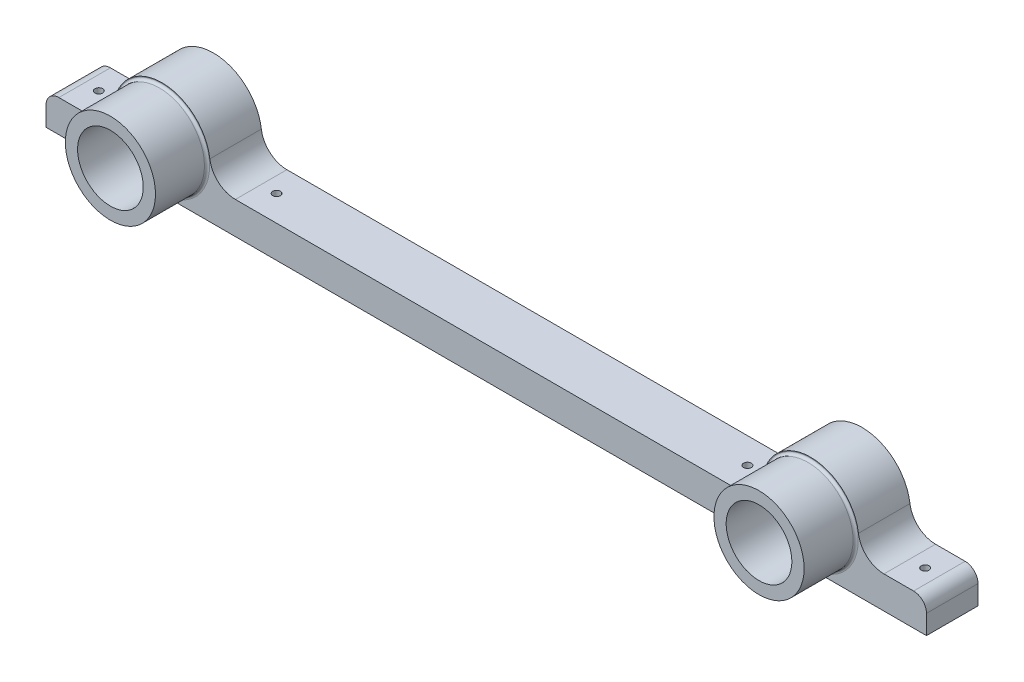
ISO-10303-21;
HEADER;
FILE_DESCRIPTION(('STEP AP214'),'2;1');
FILE_NAME('part.step','',(''),(''),'','','');
FILE_SCHEMA(('AUTOMOTIVE_DESIGN { 1 0 10303 214 1 1 1 1 }'));
ENDSEC;
DATA;
#1=APPLICATION_CONTEXT('core data for automotive mechanical design processes');
#2=APPLICATION_PROTOCOL_DEFINITION('international standard','automotive_design',2000,#1);
#3=PRODUCT_CONTEXT('',#1,'mechanical');
#4=PRODUCT('Part','Part','',(#3));
#5=PRODUCT_RELATED_PRODUCT_CATEGORY('part','',(#4));
#6=PRODUCT_DEFINITION_FORMATION('','',#4);
#7=PRODUCT_DEFINITION_CONTEXT('part definition',#1,'design');
#8=PRODUCT_DEFINITION('design','',#6,#7);
#9=PRODUCT_DEFINITION_SHAPE('','',#8);
#10=(LENGTH_UNIT() NAMED_UNIT(*) SI_UNIT(.MILLI.,.METRE.));
#11=(NAMED_UNIT(*) PLANE_ANGLE_UNIT() SI_UNIT($,.RADIAN.));
#12=(NAMED_UNIT(*) SI_UNIT($,.STERADIAN.) SOLID_ANGLE_UNIT());
#13=UNCERTAINTY_MEASURE_WITH_UNIT(LENGTH_MEASURE(1.E-05),#10,'distance_accuracy_value','');
#14=(GEOMETRIC_REPRESENTATION_CONTEXT(3) GLOBAL_UNCERTAINTY_ASSIGNED_CONTEXT((#13)) GLOBAL_UNIT_ASSIGNED_CONTEXT((#10,
#11,#12)) REPRESENTATION_CONTEXT('',''));
#15=CARTESIAN_POINT('',(0.,0.,0.));
#16=DIRECTION('',(0.,0.,1.));
#17=DIRECTION('',(1.,0.,0.));
#18=AXIS2_PLACEMENT_3D('',#15,#16,#17);
#19=CARTESIAN_POINT('',(70.29958,4.7625,5.08));
#20=DIRECTION('',(0.,0.,-1.));
#21=DIRECTION('',(-1.,0.,0.));
#22=AXIS2_PLACEMENT_3D('',#19,#20,#21);
#23=CYLINDRICAL_SURFACE('',#22,0.635000000000002);
#24=CARTESIAN_POINT('',(70.29958,4.7625,0.));
#25=DIRECTION('',(0.,0.,1.));
#26=DIRECTION('',(1.,0.,0.));
#27=AXIS2_PLACEMENT_3D('',#24,#25,#26);
#28=CIRCLE('',#27,0.635000000000002);
#29=CARTESIAN_POINT('',(70.93458,4.7625,0.));
#30=VERTEX_POINT('',#29);
#31=EDGE_CURVE('E505',#30,#30,#28,.T.);
#32=ORIENTED_EDGE('',*,*,#31,.F.);
#33=EDGE_LOOP('',(#32));
#34=FACE_BOUND('',#33,.T.);
#35=CARTESIAN_POINT('',(70.29958,4.7625,3.81));
#36=DIRECTION('',(0.,0.,1.));
#37=DIRECTION('',(1.,0.,0.));
#38=AXIS2_PLACEMENT_3D('',#35,#36,#37);
#39=CIRCLE('',#38,0.635000000000002);
#40=CARTESIAN_POINT('',(70.93458,4.7625,3.81));
#41=VERTEX_POINT('',#40);
#42=EDGE_CURVE('E200',#41,#41,#39,.T.);
#43=ORIENTED_EDGE('',*,*,#42,.T.);
#44=EDGE_LOOP('',(#43));
#45=FACE_BOUND('',#44,.T.);
#46=ADVANCED_FACE('F33',(#34,#45),#23,.F.);
#47=CARTESIAN_POINT('',(6.35,4.7625,5.08));
#48=DIRECTION('',(0.,0.,-1.));
#49=DIRECTION('',(-1.,0.,0.));
#50=AXIS2_PLACEMENT_3D('',#47,#48,#49);
#51=CYLINDRICAL_SURFACE('',#50,0.635000000000001);
#52=CARTESIAN_POINT('',(6.35,4.7625,0.));
#53=DIRECTION('',(0.,0.,1.));
#54=DIRECTION('',(1.,0.,0.));
#55=AXIS2_PLACEMENT_3D('',#52,#53,#54);
#56=CIRCLE('',#55,0.635000000000001);
#57=CARTESIAN_POINT('',(6.985,4.7625,0.));
#58=VERTEX_POINT('',#57);
#59=EDGE_CURVE('E178',#58,#58,#56,.T.);
#60=ORIENTED_EDGE('',*,*,#59,.F.);
#61=EDGE_LOOP('',(#60));
#62=FACE_BOUND('',#61,.T.);
#63=CARTESIAN_POINT('',(6.35,4.7625,3.81));
#64=DIRECTION('',(0.,0.,1.));
#65=DIRECTION('',(1.,0.,0.));
#66=AXIS2_PLACEMENT_3D('',#63,#64,#65);
#67=CIRCLE('',#66,0.635000000000001);
#68=CARTESIAN_POINT('',(6.985,4.7625,3.81));
#69=VERTEX_POINT('',#68);
#70=EDGE_CURVE('E195',#69,#69,#67,.T.);
#71=ORIENTED_EDGE('',*,*,#70,.T.);
#72=EDGE_LOOP('',(#71));
#73=FACE_BOUND('',#72,.T.);
#74=ADVANCED_FACE('F324',(#62,#73),#51,.F.);
#75=CARTESIAN_POINT('',(70.29958,4.7625,5.08));
#76=DIRECTION('',(0.,0.,1.));
#77=DIRECTION('',(1.,0.,0.));
#78=AXIS2_PLACEMENT_3D('',#75,#76,#77);
#79=PLANE('',#78);
#80=CARTESIAN_POINT('',(70.29958,4.7625,5.08));
#81=DIRECTION('',(0.,0.,1.));
#82=DIRECTION('',(1.,0.,0.));
#83=AXIS2_PLACEMENT_3D('',#80,#81,#82);
#84=CIRCLE('',#83,4.69899999999999);
#85=CARTESIAN_POINT('',(74.99858,4.7625,5.08));
#86=VERTEX_POINT('',#85);
#87=EDGE_CURVE('E210',#86,#86,#84,.F.);
#88=ORIENTED_EDGE('',*,*,#87,.T.);
#89=EDGE_LOOP('',(#88));
#90=FACE_BOUND('',#89,.T.);
#91=CARTESIAN_POINT('',(6.35,4.7625,5.08));
#92=DIRECTION('',(0.,0.,1.));
#93=DIRECTION('',(1.,0.,0.));
#94=AXIS2_PLACEMENT_3D('',#91,#92,#93);
#95=CIRCLE('',#94,4.699);
#96=CARTESIAN_POINT('',(11.049,4.7625,5.08));
#97=VERTEX_POINT('',#96);
#98=EDGE_CURVE('E207',#97,#97,#95,.F.);
#99=ORIENTED_EDGE('',*,*,#98,.T.);
#100=EDGE_LOOP('',(#99));
#101=FACE_BOUND('',#100,.T.);
#102=DIRECTION('',(0.,1.,0.));
#103=VECTOR('',#102,1.);
#104=CARTESIAN_POINT('',(81.72958,3.175,5.08));
#105=LINE('',#104,#103);
#106=CARTESIAN_POINT('',(81.72958,0.,5.08));
#107=VERTEX_POINT('',#106);
#108=CARTESIAN_POINT('',(81.72958,1.90500000000001,5.08));
#109=VERTEX_POINT('',#108);
#110=EDGE_CURVE('E137',#107,#109,#105,.T.);
#111=ORIENTED_EDGE('',*,*,#110,.T.);
#112=CARTESIAN_POINT('',(80.45958,1.90500000000001,5.08));
#113=DIRECTION('',(0.,0.,1.));
#114=DIRECTION('',(1.,0.,0.));
#115=AXIS2_PLACEMENT_3D('',#112,#113,#114);
#116=CIRCLE('',#115,1.27);
#117=CARTESIAN_POINT('',(80.45958,3.175,5.08));
#118=VERTEX_POINT('',#117);
#119=EDGE_CURVE('E263',#109,#118,#116,.T.);
#120=ORIENTED_EDGE('',*,*,#119,.T.);
#121=DIRECTION('',(-1.,0.,0.));
#122=VECTOR('',#121,1.);
#123=CARTESIAN_POINT('',(76.64958,3.175,5.08));
#124=LINE('',#123,#122);
#125=CARTESIAN_POINT('',(77.5396939493795,3.175,5.08));
#126=VERTEX_POINT('',#125);
#127=EDGE_CURVE('E159',#118,#126,#124,.T.);
#128=ORIENTED_EDGE('',*,*,#127,.T.);
#129=CARTESIAN_POINT('',(77.5396939493795,5.71500000000001,5.08));
#130=DIRECTION('',(0.,0.,1.));
#131=DIRECTION('',(1.,0.,0.));
#132=AXIS2_PLACEMENT_3D('',#129,#130,#131);
#133=CIRCLE('',#132,2.54);
#134=CARTESIAN_POINT('',(75.0213934452475,5.38369565217392,5.08));
#135=VERTEX_POINT('',#134);
#136=EDGE_CURVE('E240',#126,#135,#133,.F.);
#137=ORIENTED_EDGE('',*,*,#136,.T.);
#138=CARTESIAN_POINT('',(70.29958,4.7625,5.08));
#139=DIRECTION('',(0.,0.,1.));
#140=DIRECTION('',(1.,0.,0.));
#141=AXIS2_PLACEMENT_3D('',#138,#139,#140);
#142=CIRCLE('',#141,4.7625);
#143=CARTESIAN_POINT('',(65.5777665547525,5.38369565217391,5.08));
#144=VERTEX_POINT('',#143);
#145=EDGE_CURVE('E161',#135,#144,#142,.T.);
#146=ORIENTED_EDGE('',*,*,#145,.T.);
#147=CARTESIAN_POINT('',(63.0594660506205,5.715,5.08));
#148=DIRECTION('',(0.,0.,1.));
#149=DIRECTION('',(1.,0.,0.));
#150=AXIS2_PLACEMENT_3D('',#147,#148,#149);
#151=CIRCLE('',#150,2.54);
#152=CARTESIAN_POINT('',(63.0594660506205,3.175,5.08));
#153=VERTEX_POINT('',#152);
#154=EDGE_CURVE('E248',#144,#153,#151,.F.);
#155=ORIENTED_EDGE('',*,*,#154,.T.);
#156=DIRECTION('',(-1.,0.,0.));
#157=VECTOR('',#156,1.);
#158=CARTESIAN_POINT('',(11.1125,3.175,5.08));
#159=LINE('',#158,#157);
#160=CARTESIAN_POINT('',(13.5901139493795,3.175,5.08));
#161=VERTEX_POINT('',#160);
#162=EDGE_CURVE('E167',#153,#161,#159,.T.);
#163=ORIENTED_EDGE('',*,*,#162,.T.);
#164=CARTESIAN_POINT('',(13.5901139493795,5.715,5.08));
#165=DIRECTION('',(0.,0.,1.));
#166=DIRECTION('',(1.,0.,0.));
#167=AXIS2_PLACEMENT_3D('',#164,#165,#166);
#168=CIRCLE('',#167,2.54);
#169=CARTESIAN_POINT('',(11.0718134452475,5.38369565217391,5.08));
#170=VERTEX_POINT('',#169);
#171=EDGE_CURVE('E244',#161,#170,#168,.F.);
#172=ORIENTED_EDGE('',*,*,#171,.T.);
#173=CARTESIAN_POINT('',(6.35,4.7625,5.08));
#174=DIRECTION('',(0.,0.,1.));
#175=DIRECTION('',(-1.,0.,0.));
#176=AXIS2_PLACEMENT_3D('',#173,#174,#175);
#177=CIRCLE('',#176,4.7625);
#178=CARTESIAN_POINT('',(1.62818655475248,5.38369565217391,5.08));
#179=VERTEX_POINT('',#178);
#180=EDGE_CURVE('E170',#170,#179,#177,.T.);
#181=ORIENTED_EDGE('',*,*,#180,.T.);
#182=CARTESIAN_POINT('',(-0.890113949379528,5.715,5.08));
#183=DIRECTION('',(0.,0.,1.));
#184=DIRECTION('',(1.,0.,0.));
#185=AXIS2_PLACEMENT_3D('',#182,#183,#184);
#186=CIRCLE('',#185,2.54);
#187=CARTESIAN_POINT('',(-0.890113949379527,3.175,5.08));
#188=VERTEX_POINT('',#187);
#189=EDGE_CURVE('E252',#179,#188,#186,.F.);
#190=ORIENTED_EDGE('',*,*,#189,.T.);
#191=DIRECTION('',(-1.,0.,0.));
#192=VECTOR('',#191,1.);
#193=CARTESIAN_POINT('',(0.,3.175,5.08));
#194=LINE('',#193,#192);
#195=CARTESIAN_POINT('',(-3.81,3.175,5.08));
#196=VERTEX_POINT('',#195);
#197=EDGE_CURVE('E173',#188,#196,#194,.T.);
#198=ORIENTED_EDGE('',*,*,#197,.T.);
#199=CARTESIAN_POINT('',(-3.81,1.905,5.08));
#200=DIRECTION('',(0.,0.,1.));
#201=DIRECTION('',(1.,0.,0.));
#202=AXIS2_PLACEMENT_3D('',#199,#200,#201);
#203=CIRCLE('',#202,1.27);
#204=CARTESIAN_POINT('',(-5.08,1.905,5.08));
#205=VERTEX_POINT('',#204);
#206=EDGE_CURVE('E48',#196,#205,#203,.T.);
#207=ORIENTED_EDGE('',*,*,#206,.T.);
#208=DIRECTION('',(0.,-1.,0.));
#209=VECTOR('',#208,1.);
#210=CARTESIAN_POINT('',(-5.08,3.175,5.08));
#211=LINE('',#210,#209);
#212=CARTESIAN_POINT('',(-5.08,0.,5.08));
#213=VERTEX_POINT('',#212);
#214=EDGE_CURVE('E139',#205,#213,#211,.T.);
#215=ORIENTED_EDGE('',*,*,#214,.T.);
#216=DIRECTION('',(1.,0.,0.));
#217=VECTOR('',#216,1.);
#218=CARTESIAN_POINT('',(-5.08,0.,5.08));
#219=LINE('',#218,#217);
#220=EDGE_CURVE('E133',#213,#107,#219,.T.);
#221=ORIENTED_EDGE('',*,*,#220,.T.);
#222=EDGE_LOOP('',(#111,#120,#128,#137,#146,#155,#163,#172,#181,#190,#198,#207,#215,#221));
#223=FACE_BOUND('',#222,.T.);
#224=ADVANCED_FACE('F135',(#90,#101,#223),#79,.T.);
#225=CARTESIAN_POINT('',(70.29958,4.7625,0.));
#226=DIRECTION('',(0.,0.,1.));
#227=DIRECTION('',(1.,0.,0.));
#228=AXIS2_PLACEMENT_3D('',#225,#226,#227);
#229=PLANE('',#228);
#230=ORIENTED_EDGE('',*,*,#59,.T.);
#231=EDGE_LOOP('',(#230));
#232=FACE_BOUND('',#231,.T.);
#233=DIRECTION('',(-1.,0.,0.));
#234=VECTOR('',#233,1.);
#235=CARTESIAN_POINT('',(75.06208,3.175,0.));
#236=LINE('',#235,#234);
#237=CARTESIAN_POINT('',(80.45958,3.17500000000001,0.));
#238=VERTEX_POINT('',#237);
#239=CARTESIAN_POINT('',(77.5396939493795,3.17500000000001,0.));
#240=VERTEX_POINT('',#239);
#241=EDGE_CURVE('E180',#238,#240,#236,.T.);
#242=ORIENTED_EDGE('',*,*,#241,.F.);
#243=CARTESIAN_POINT('',(80.45958,1.90500000000001,0.));
#244=DIRECTION('',(0.,0.,1.));
#245=DIRECTION('',(1.,0.,0.));
#246=AXIS2_PLACEMENT_3D('',#243,#244,#245);
#247=CIRCLE('',#246,1.27);
#248=CARTESIAN_POINT('',(81.72958,1.90500000000001,0.));
#249=VERTEX_POINT('',#248);
#250=EDGE_CURVE('E259',#238,#249,#247,.F.);
#251=ORIENTED_EDGE('',*,*,#250,.T.);
#252=DIRECTION('',(0.,1.,0.));
#253=VECTOR('',#252,1.);
#254=CARTESIAN_POINT('',(81.72958,3.175,0.));
#255=LINE('',#254,#253);
#256=CARTESIAN_POINT('',(81.72958,0.,0.));
#257=VERTEX_POINT('',#256);
#258=EDGE_CURVE('E177',#257,#249,#255,.T.);
#259=ORIENTED_EDGE('',*,*,#258,.F.);
#260=DIRECTION('',(1.,0.,0.));
#261=VECTOR('',#260,1.);
#262=CARTESIAN_POINT('',(81.72958,0.,0.));
#263=LINE('',#262,#261);
#264=CARTESIAN_POINT('',(-5.08,0.,0.));
#265=VERTEX_POINT('',#264);
#266=EDGE_CURVE('E149',#265,#257,#263,.T.);
#267=ORIENTED_EDGE('',*,*,#266,.F.);
#268=DIRECTION('',(0.,-1.,0.));
#269=VECTOR('',#268,1.);
#270=CARTESIAN_POINT('',(-5.08,3.175,0.));
#271=LINE('',#270,#269);
#272=CARTESIAN_POINT('',(-5.08,1.905,0.));
#273=VERTEX_POINT('',#272);
#274=EDGE_CURVE('E143',#273,#265,#271,.T.);
#275=ORIENTED_EDGE('',*,*,#274,.F.);
#276=CARTESIAN_POINT('',(-3.81,1.905,0.));
#277=DIRECTION('',(0.,0.,1.));
#278=DIRECTION('',(1.,0.,0.));
#279=AXIS2_PLACEMENT_3D('',#276,#277,#278);
#280=CIRCLE('',#279,1.27);
#281=CARTESIAN_POINT('',(-3.81,3.175,0.));
#282=VERTEX_POINT('',#281);
#283=EDGE_CURVE('E257',#273,#282,#280,.F.);
#284=ORIENTED_EDGE('',*,*,#283,.T.);
#285=DIRECTION('',(-1.,0.,0.));
#286=VECTOR('',#285,1.);
#287=CARTESIAN_POINT('',(0.,3.175,0.));
#288=LINE('',#287,#286);
#289=CARTESIAN_POINT('',(-0.890113949379527,3.175,0.));
#290=VERTEX_POINT('',#289);
#291=EDGE_CURVE('E191',#290,#282,#288,.T.);
#292=ORIENTED_EDGE('',*,*,#291,.F.);
#293=CARTESIAN_POINT('',(-0.890113949379528,5.715,0.));
#294=DIRECTION('',(0.,0.,1.));
#295=DIRECTION('',(1.,0.,0.));
#296=AXIS2_PLACEMENT_3D('',#293,#294,#295);
#297=CIRCLE('',#296,2.54);
#298=CARTESIAN_POINT('',(1.62818655475248,5.38369565217391,0.));
#299=VERTEX_POINT('',#298);
#300=EDGE_CURVE('E250',#290,#299,#297,.T.);
#301=ORIENTED_EDGE('',*,*,#300,.T.);
#302=CARTESIAN_POINT('',(6.35,4.7625,0.));
#303=DIRECTION('',(0.,0.,1.));
#304=DIRECTION('',(-1.,0.,0.));
#305=AXIS2_PLACEMENT_3D('',#302,#303,#304);
#306=CIRCLE('',#305,4.7625);
#307=CARTESIAN_POINT('',(11.0718134452475,5.38369565217391,0.));
#308=VERTEX_POINT('',#307);
#309=EDGE_CURVE('E188',#308,#299,#306,.T.);
#310=ORIENTED_EDGE('',*,*,#309,.F.);
#311=CARTESIAN_POINT('',(13.5901139493795,5.715,0.));
#312=DIRECTION('',(0.,0.,1.));
#313=DIRECTION('',(1.,0.,0.));
#314=AXIS2_PLACEMENT_3D('',#311,#312,#313);
#315=CIRCLE('',#314,2.54);
#316=CARTESIAN_POINT('',(13.5901139493795,3.175,0.));
#317=VERTEX_POINT('',#316);
#318=EDGE_CURVE('E242',#308,#317,#315,.T.);
#319=ORIENTED_EDGE('',*,*,#318,.T.);
#320=DIRECTION('',(-1.,0.,0.));
#321=VECTOR('',#320,1.);
#322=CARTESIAN_POINT('',(11.1125,3.175,0.));
#323=LINE('',#322,#321);
#324=CARTESIAN_POINT('',(63.0594660506205,3.175,0.));
#325=VERTEX_POINT('',#324);
#326=EDGE_CURVE('E185',#325,#317,#323,.T.);
#327=ORIENTED_EDGE('',*,*,#326,.F.);
#328=CARTESIAN_POINT('',(63.0594660506205,5.715,0.));
#329=DIRECTION('',(0.,0.,1.));
#330=DIRECTION('',(1.,0.,0.));
#331=AXIS2_PLACEMENT_3D('',#328,#329,#330);
#332=CIRCLE('',#331,2.54);
#333=CARTESIAN_POINT('',(65.5777665547525,5.38369565217391,0.));
#334=VERTEX_POINT('',#333);
#335=EDGE_CURVE('E246',#325,#334,#332,.T.);
#336=ORIENTED_EDGE('',*,*,#335,.T.);
#337=CARTESIAN_POINT('',(70.29958,4.7625,0.));
#338=DIRECTION('',(0.,0.,1.));
#339=DIRECTION('',(1.,0.,0.));
#340=AXIS2_PLACEMENT_3D('',#337,#338,#339);
#341=CIRCLE('',#340,4.7625);
#342=CARTESIAN_POINT('',(75.0213934452475,5.38369565217392,0.));
#343=VERTEX_POINT('',#342);
#344=EDGE_CURVE('E182',#343,#334,#341,.T.);
#345=ORIENTED_EDGE('',*,*,#344,.F.);
#346=CARTESIAN_POINT('',(77.5396939493795,5.71500000000001,0.));
#347=DIRECTION('',(0.,0.,1.));
#348=DIRECTION('',(1.,0.,0.));
#349=AXIS2_PLACEMENT_3D('',#346,#347,#348);
#350=CIRCLE('',#349,2.54);
#351=EDGE_CURVE('E237',#343,#240,#350,.T.);
#352=ORIENTED_EDGE('',*,*,#351,.T.);
#353=EDGE_LOOP('',(#242,#251,#259,#267,#275,#284,#292,#301,#310,#319,#327,#336,#345,#352));
#354=FACE_BOUND('',#353,.T.);
#355=ORIENTED_EDGE('',*,*,#31,.T.);
#356=EDGE_LOOP('',(#355));
#357=FACE_BOUND('',#356,.T.);
#358=ADVANCED_FACE('F272',(#232,#354,#357),#229,.F.);
#359=CARTESIAN_POINT('',(81.72958,0.,5.08));
#360=DIRECTION('',(0.,1.,0.));
#361=DIRECTION('',(-1.,0.,0.));
#362=AXIS2_PLACEMENT_3D('',#359,#360,#361);
#363=PLANE('',#362);
#364=CARTESIAN_POINT('',(15.113,0.,2.54));
#365=DIRECTION('',(0.,1.,0.));
#366=DIRECTION('',(-1.,0.,0.));
#367=AXIS2_PLACEMENT_3D('',#364,#365,#366);
#368=CIRCLE('',#367,0.381);
#369=CARTESIAN_POINT('',(14.732,0.,2.54));
#370=VERTEX_POINT('',#369);
#371=EDGE_CURVE('E542',#370,#370,#368,.T.);
#372=ORIENTED_EDGE('',*,*,#371,.T.);
#373=EDGE_LOOP('',(#372));
#374=FACE_BOUND('',#373,.T.);
#375=CARTESIAN_POINT('',(61.53658,0.,2.54));
#376=DIRECTION('',(0.,1.,0.));
#377=DIRECTION('',(-1.,0.,0.));
#378=AXIS2_PLACEMENT_3D('',#375,#376,#377);
#379=CIRCLE('',#378,0.381000000000001);
#380=CARTESIAN_POINT('',(61.15558,0.,2.54));
#381=VERTEX_POINT('',#380);
#382=EDGE_CURVE('E536',#381,#381,#379,.T.);
#383=ORIENTED_EDGE('',*,*,#382,.T.);
#384=EDGE_LOOP('',(#383));
#385=FACE_BOUND('',#384,.T.);
#386=CARTESIAN_POINT('',(79.06258,0.,2.54));
#387=DIRECTION('',(0.,1.,0.));
#388=DIRECTION('',(-1.,0.,0.));
#389=AXIS2_PLACEMENT_3D('',#386,#387,#388);
#390=CIRCLE('',#389,0.381000000000002);
#391=CARTESIAN_POINT('',(78.68158,0.,2.54));
#392=VERTEX_POINT('',#391);
#393=EDGE_CURVE('E530',#392,#392,#390,.T.);
#394=ORIENTED_EDGE('',*,*,#393,.T.);
#395=EDGE_LOOP('',(#394));
#396=FACE_BOUND('',#395,.T.);
#397=CARTESIAN_POINT('',(-2.413,0.,2.54));
#398=DIRECTION('',(0.,1.,0.));
#399=DIRECTION('',(-1.,0.,0.));
#400=AXIS2_PLACEMENT_3D('',#397,#398,#399);
#401=CIRCLE('',#400,0.381);
#402=CARTESIAN_POINT('',(-2.794,0.,2.54));
#403=VERTEX_POINT('',#402);
#404=EDGE_CURVE('E524',#403,#403,#401,.T.);
#405=ORIENTED_EDGE('',*,*,#404,.T.);
#406=EDGE_LOOP('',(#405));
#407=FACE_BOUND('',#406,.T.);
#408=ORIENTED_EDGE('',*,*,#266,.T.);
#409=DIRECTION('',(0.,0.,-1.));
#410=VECTOR('',#409,1.);
#411=CARTESIAN_POINT('',(81.72958,0.,5.08));
#412=LINE('',#411,#410);
#413=EDGE_CURVE('E146',#107,#257,#412,.T.);
#414=ORIENTED_EDGE('',*,*,#413,.F.);
#415=ORIENTED_EDGE('',*,*,#220,.F.);
#416=DIRECTION('',(0.,0.,-1.));
#417=VECTOR('',#416,1.);
#418=CARTESIAN_POINT('',(-5.08,0.,5.08));
#419=LINE('',#418,#417);
#420=EDGE_CURVE('E154',#213,#265,#419,.T.);
#421=ORIENTED_EDGE('',*,*,#420,.T.);
#422=EDGE_LOOP('',(#408,#414,#415,#421));
#423=FACE_BOUND('',#422,.T.);
#424=ADVANCED_FACE('F147',(#374,#385,#396,#407,#423),#363,.F.);
#425=CARTESIAN_POINT('',(81.72958,3.175,5.08));
#426=DIRECTION('',(-1.,0.,0.));
#427=DIRECTION('',(0.,0.,1.));
#428=AXIS2_PLACEMENT_3D('',#425,#426,#427);
#429=PLANE('',#428);
#430=ORIENTED_EDGE('',*,*,#258,.T.);
#431=DIRECTION('',(0.,0.,-1.));
#432=VECTOR('',#431,1.);
#433=CARTESIAN_POINT('',(81.72958,1.90500000000001,5.08));
#434=LINE('',#433,#432);
#435=EDGE_CURVE('E158',#249,#109,#434,.F.);
#436=ORIENTED_EDGE('',*,*,#435,.T.);
#437=ORIENTED_EDGE('',*,*,#110,.F.);
#438=ORIENTED_EDGE('',*,*,#413,.T.);
#439=EDGE_LOOP('',(#430,#436,#437,#438));
#440=FACE_BOUND('',#439,.T.);
#441=ADVANCED_FACE('F156',(#440),#429,.F.);
#442=CARTESIAN_POINT('',(75.06208,3.175,5.08));
#443=DIRECTION('',(0.,-1.,0.));
#444=DIRECTION('',(1.,0.,0.));
#445=AXIS2_PLACEMENT_3D('',#442,#443,#444);
#446=PLANE('',#445);
#447=CARTESIAN_POINT('',(79.06258,3.175,2.54));
#448=DIRECTION('',(0.,1.,0.));
#449=DIRECTION('',(-1.,0.,0.));
#450=AXIS2_PLACEMENT_3D('',#447,#448,#449);
#451=CIRCLE('',#450,0.381000000000002);
#452=CARTESIAN_POINT('',(78.68158,3.175,2.54));
#453=VERTEX_POINT('',#452);
#454=EDGE_CURVE('E533',#453,#453,#451,.T.);
#455=ORIENTED_EDGE('',*,*,#454,.F.);
#456=EDGE_LOOP('',(#455));
#457=FACE_BOUND('',#456,.T.);
#458=ORIENTED_EDGE('',*,*,#127,.F.);
#459=DIRECTION('',(0.,0.,-1.));
#460=VECTOR('',#459,1.);
#461=CARTESIAN_POINT('',(80.45958,3.17500000000001,5.08));
#462=LINE('',#461,#460);
#463=EDGE_CURVE('E254',#118,#238,#462,.T.);
#464=ORIENTED_EDGE('',*,*,#463,.T.);
#465=ORIENTED_EDGE('',*,*,#241,.T.);
#466=DIRECTION('',(0.,0.,1.));
#467=VECTOR('',#466,1.);
#468=CARTESIAN_POINT('',(77.5396939493795,3.17500000000001,5.08));
#469=LINE('',#468,#467);
#470=EDGE_CURVE('E221',#240,#126,#469,.T.);
#471=ORIENTED_EDGE('',*,*,#470,.T.);
#472=EDGE_LOOP('',(#458,#464,#465,#471));
#473=FACE_BOUND('',#472,.T.);
#474=ADVANCED_FACE('F280',(#457,#473),#446,.F.);
#475=CARTESIAN_POINT('',(70.29958,4.7625,5.08));
#476=DIRECTION('',(0.,0.,-1.));
#477=DIRECTION('',(-1.,0.,0.));
#478=AXIS2_PLACEMENT_3D('',#475,#476,#477);
#479=CYLINDRICAL_SURFACE('',#478,4.7625);
#480=ORIENTED_EDGE('',*,*,#145,.F.);
#481=DIRECTION('',(0.,0.,-1.));
#482=VECTOR('',#481,1.);
#483=CARTESIAN_POINT('',(75.0213934452475,5.38369565217392,5.08));
#484=LINE('',#483,#482);
#485=EDGE_CURVE('E218',#135,#343,#484,.T.);
#486=ORIENTED_EDGE('',*,*,#485,.T.);
#487=ORIENTED_EDGE('',*,*,#344,.T.);
#488=DIRECTION('',(0.,0.,-1.));
#489=VECTOR('',#488,1.);
#490=CARTESIAN_POINT('',(65.5777665547525,5.38369565217391,5.08));
#491=LINE('',#490,#489);
#492=EDGE_CURVE('E216',#334,#144,#491,.F.);
#493=ORIENTED_EDGE('',*,*,#492,.T.);
#494=EDGE_LOOP('',(#480,#486,#487,#493));
#495=FACE_BOUND('',#494,.T.);
#496=ADVANCED_FACE('F289',(#495),#479,.T.);
#497=CARTESIAN_POINT('',(11.1125,3.175,5.08));
#498=DIRECTION('',(0.,-1.,0.));
#499=DIRECTION('',(1.,0.,0.));
#500=AXIS2_PLACEMENT_3D('',#497,#498,#499);
#501=PLANE('',#500);
#502=CARTESIAN_POINT('',(15.113,3.175,2.54));
#503=DIRECTION('',(0.,1.,0.));
#504=DIRECTION('',(-1.,0.,0.));
#505=AXIS2_PLACEMENT_3D('',#502,#503,#504);
#506=CIRCLE('',#505,0.381);
#507=CARTESIAN_POINT('',(14.732,3.175,2.54));
#508=VERTEX_POINT('',#507);
#509=EDGE_CURVE('E545',#508,#508,#506,.T.);
#510=ORIENTED_EDGE('',*,*,#509,.F.);
#511=EDGE_LOOP('',(#510));
#512=FACE_BOUND('',#511,.T.);
#513=CARTESIAN_POINT('',(61.53658,3.175,2.54));
#514=DIRECTION('',(0.,1.,0.));
#515=DIRECTION('',(-1.,0.,0.));
#516=AXIS2_PLACEMENT_3D('',#513,#514,#515);
#517=CIRCLE('',#516,0.381000000000001);
#518=CARTESIAN_POINT('',(61.15558,3.175,2.54));
#519=VERTEX_POINT('',#518);
#520=EDGE_CURVE('E539',#519,#519,#517,.T.);
#521=ORIENTED_EDGE('',*,*,#520,.F.);
#522=EDGE_LOOP('',(#521));
#523=FACE_BOUND('',#522,.T.);
#524=ORIENTED_EDGE('',*,*,#326,.T.);
#525=DIRECTION('',(0.,0.,1.));
#526=VECTOR('',#525,1.);
#527=CARTESIAN_POINT('',(13.5901139493795,3.175,5.08));
#528=LINE('',#527,#526);
#529=EDGE_CURVE('E232',#317,#161,#528,.T.);
#530=ORIENTED_EDGE('',*,*,#529,.T.);
#531=ORIENTED_EDGE('',*,*,#162,.F.);
#532=DIRECTION('',(0.,0.,1.));
#533=VECTOR('',#532,1.);
#534=CARTESIAN_POINT('',(63.0594660506205,3.175,0.));
#535=LINE('',#534,#533);
#536=EDGE_CURVE('E229',#153,#325,#535,.F.);
#537=ORIENTED_EDGE('',*,*,#536,.T.);
#538=EDGE_LOOP('',(#524,#530,#531,#537));
#539=FACE_BOUND('',#538,.T.);
#540=ADVANCED_FACE('F298',(#512,#523,#539),#501,.F.);
#541=CARTESIAN_POINT('',(6.35,4.7625,5.08));
#542=DIRECTION('',(0.,0.,-1.));
#543=DIRECTION('',(-1.,0.,0.));
#544=AXIS2_PLACEMENT_3D('',#541,#542,#543);
#545=CYLINDRICAL_SURFACE('',#544,4.7625);
#546=ORIENTED_EDGE('',*,*,#180,.F.);
#547=DIRECTION('',(0.,0.,-1.));
#548=VECTOR('',#547,1.);
#549=CARTESIAN_POINT('',(11.0718134452475,5.38369565217391,5.08));
#550=LINE('',#549,#548);
#551=EDGE_CURVE('E226',#170,#308,#550,.T.);
#552=ORIENTED_EDGE('',*,*,#551,.T.);
#553=ORIENTED_EDGE('',*,*,#309,.T.);
#554=DIRECTION('',(0.,0.,-1.));
#555=VECTOR('',#554,1.);
#556=CARTESIAN_POINT('',(1.62818655475248,5.38369565217391,5.08));
#557=LINE('',#556,#555);
#558=EDGE_CURVE('E224',#299,#179,#557,.F.);
#559=ORIENTED_EDGE('',*,*,#558,.T.);
#560=EDGE_LOOP('',(#546,#552,#553,#559));
#561=FACE_BOUND('',#560,.T.);
#562=ADVANCED_FACE('F307',(#561),#545,.T.);
#563=CARTESIAN_POINT('',(0.,3.175,5.08));
#564=DIRECTION('',(0.,-1.,0.));
#565=DIRECTION('',(1.,0.,0.));
#566=AXIS2_PLACEMENT_3D('',#563,#564,#565);
#567=PLANE('',#566);
#568=CARTESIAN_POINT('',(-2.413,3.175,2.54));
#569=DIRECTION('',(0.,1.,0.));
#570=DIRECTION('',(-1.,0.,0.));
#571=AXIS2_PLACEMENT_3D('',#568,#569,#570);
#572=CIRCLE('',#571,0.381);
#573=CARTESIAN_POINT('',(-2.794,3.175,2.54));
#574=VERTEX_POINT('',#573);
#575=EDGE_CURVE('E527',#574,#574,#572,.T.);
#576=ORIENTED_EDGE('',*,*,#575,.F.);
#577=EDGE_LOOP('',(#576));
#578=FACE_BOUND('',#577,.T.);
#579=ORIENTED_EDGE('',*,*,#291,.T.);
#580=DIRECTION('',(0.,0.,-1.));
#581=VECTOR('',#580,1.);
#582=CARTESIAN_POINT('',(-3.81,3.175,5.08));
#583=LINE('',#582,#581);
#584=EDGE_CURVE('E11',#282,#196,#583,.F.);
#585=ORIENTED_EDGE('',*,*,#584,.T.);
#586=ORIENTED_EDGE('',*,*,#197,.F.);
#587=DIRECTION('',(0.,0.,1.));
#588=VECTOR('',#587,1.);
#589=CARTESIAN_POINT('',(-0.890113949379527,3.175,0.));
#590=LINE('',#589,#588);
#591=EDGE_CURVE('E234',#188,#290,#590,.F.);
#592=ORIENTED_EDGE('',*,*,#591,.T.);
#593=EDGE_LOOP('',(#579,#585,#586,#592));
#594=FACE_BOUND('',#593,.T.);
#595=ADVANCED_FACE('F313',(#578,#594),#567,.F.);
#596=CARTESIAN_POINT('',(-5.08,3.175,5.08));
#597=DIRECTION('',(1.,0.,0.));
#598=DIRECTION('',(0.,1.,0.));
#599=AXIS2_PLACEMENT_3D('',#596,#597,#598);
#600=PLANE('',#599);
#601=ORIENTED_EDGE('',*,*,#214,.F.);
#602=DIRECTION('',(0.,0.,-1.));
#603=VECTOR('',#602,1.);
#604=CARTESIAN_POINT('',(-5.08,1.905,5.08));
#605=LINE('',#604,#603);
#606=EDGE_CURVE('E41',#205,#273,#605,.T.);
#607=ORIENTED_EDGE('',*,*,#606,.T.);
#608=ORIENTED_EDGE('',*,*,#274,.T.);
#609=ORIENTED_EDGE('',*,*,#420,.F.);
#610=EDGE_LOOP('',(#601,#607,#608,#609));
#611=FACE_BOUND('',#610,.T.);
#612=ADVANCED_FACE('F268',(#611),#600,.F.);
#613=CARTESIAN_POINT('',(6.35,4.7625,10.16));
#614=DIRECTION('',(0.,0.,1.));
#615=DIRECTION('',(1.,0.,0.));
#616=AXIS2_PLACEMENT_3D('',#613,#614,#615);
#617=PLANE('',#616);
#618=CARTESIAN_POINT('',(6.35,4.7625,10.16));
#619=DIRECTION('',(0.,0.,1.));
#620=DIRECTION('',(1.,0.,0.));
#621=AXIS2_PLACEMENT_3D('',#618,#619,#620);
#622=CIRCLE('',#621,3.2385);
#623=CARTESIAN_POINT('',(9.5885,4.7625,10.16));
#624=VERTEX_POINT('',#623);
#625=EDGE_CURVE('E203',#624,#624,#622,.T.);
#626=ORIENTED_EDGE('',*,*,#625,.F.);
#627=EDGE_LOOP('',(#626));
#628=FACE_BOUND('',#627,.T.);
#629=CARTESIAN_POINT('',(6.35,4.7625,10.16));
#630=DIRECTION('',(0.,0.,1.));
#631=DIRECTION('',(1.,0.,0.));
#632=AXIS2_PLACEMENT_3D('',#629,#630,#631);
#633=CIRCLE('',#632,4.445);
#634=CARTESIAN_POINT('',(10.795,4.7625,10.16));
#635=VERTEX_POINT('',#634);
#636=EDGE_CURVE('E503',#635,#635,#633,.T.);
#637=ORIENTED_EDGE('',*,*,#636,.T.);
#638=EDGE_LOOP('',(#637));
#639=FACE_BOUND('',#638,.T.);
#640=ADVANCED_FACE('F346',(#628,#639),#617,.T.);
#641=CARTESIAN_POINT('',(6.35,4.7625,10.16));
#642=DIRECTION('',(0.,0.,-1.));
#643=DIRECTION('',(-1.,0.,0.));
#644=AXIS2_PLACEMENT_3D('',#641,#642,#643);
#645=CYLINDRICAL_SURFACE('',#644,4.445);
#646=CARTESIAN_POINT('',(6.35,4.7625,5.334));
#647=DIRECTION('',(0.,0.,1.));
#648=DIRECTION('',(1.,0.,0.));
#649=AXIS2_PLACEMENT_3D('',#646,#647,#648);
#650=CIRCLE('',#649,4.445);
#651=CARTESIAN_POINT('',(10.795,4.7625,5.334));
#652=VERTEX_POINT('',#651);
#653=EDGE_CURVE('E213',#652,#652,#650,.T.);
#654=ORIENTED_EDGE('',*,*,#653,.T.);
#655=EDGE_LOOP('',(#654));
#656=FACE_BOUND('',#655,.T.);
#657=ORIENTED_EDGE('',*,*,#636,.F.);
#658=EDGE_LOOP('',(#657));
#659=FACE_BOUND('',#658,.T.);
#660=ADVANCED_FACE('F335',(#656,#659),#645,.T.);
#661=CARTESIAN_POINT('',(70.29958,4.7625,10.16));
#662=DIRECTION('',(0.,0.,1.));
#663=DIRECTION('',(1.,0.,0.));
#664=AXIS2_PLACEMENT_3D('',#661,#662,#663);
#665=PLANE('',#664);
#666=CARTESIAN_POINT('',(70.29958,4.7625,10.16));
#667=DIRECTION('',(0.,0.,1.));
#668=DIRECTION('',(1.,0.,0.));
#669=AXIS2_PLACEMENT_3D('',#666,#667,#668);
#670=CIRCLE('',#669,3.23849999999999);
#671=CARTESIAN_POINT('',(73.53808,4.7625,10.16));
#672=VERTEX_POINT('',#671);
#673=EDGE_CURVE('E521',#672,#672,#670,.T.);
#674=ORIENTED_EDGE('',*,*,#673,.F.);
#675=EDGE_LOOP('',(#674));
#676=FACE_BOUND('',#675,.T.);
#677=CARTESIAN_POINT('',(70.29958,4.7625,10.16));
#678=DIRECTION('',(0.,0.,1.));
#679=DIRECTION('',(1.,0.,0.));
#680=AXIS2_PLACEMENT_3D('',#677,#678,#679);
#681=CIRCLE('',#680,4.44499999999999);
#682=CARTESIAN_POINT('',(74.74458,4.7625,10.16));
#683=VERTEX_POINT('',#682);
#684=EDGE_CURVE('E198',#683,#683,#681,.T.);
#685=ORIENTED_EDGE('',*,*,#684,.T.);
#686=EDGE_LOOP('',(#685));
#687=FACE_BOUND('',#686,.T.);
#688=ADVANCED_FACE('F486',(#676,#687),#665,.T.);
#689=CARTESIAN_POINT('',(70.29958,4.7625,10.16));
#690=DIRECTION('',(0.,0.,-1.));
#691=DIRECTION('',(-1.,0.,0.));
#692=AXIS2_PLACEMENT_3D('',#689,#690,#691);
#693=CYLINDRICAL_SURFACE('',#692,4.44499999999999);
#694=CARTESIAN_POINT('',(70.29958,4.7625,5.334));
#695=DIRECTION('',(0.,0.,1.));
#696=DIRECTION('',(1.,0.,0.));
#697=AXIS2_PLACEMENT_3D('',#694,#695,#696);
#698=CIRCLE('',#697,4.44499999999999);
#699=CARTESIAN_POINT('',(74.74458,4.7625,5.334));
#700=VERTEX_POINT('',#699);
#701=EDGE_CURVE('E153',#700,#700,#698,.T.);
#702=ORIENTED_EDGE('',*,*,#701,.T.);
#703=EDGE_LOOP('',(#702));
#704=FACE_BOUND('',#703,.T.);
#705=ORIENTED_EDGE('',*,*,#684,.F.);
#706=EDGE_LOOP('',(#705));
#707=FACE_BOUND('',#706,.T.);
#708=ADVANCED_FACE('F484',(#704,#707),#693,.T.);
#709=CARTESIAN_POINT('',(6.35,4.7625,3.81));
#710=DIRECTION('',(0.,0.,1.));
#711=DIRECTION('',(1.,0.,0.));
#712=AXIS2_PLACEMENT_3D('',#709,#710,#711);
#713=CYLINDRICAL_SURFACE('',#712,3.2385);
#714=CARTESIAN_POINT('',(6.35,4.7625,3.81));
#715=DIRECTION('',(0.,0.,1.));
#716=DIRECTION('',(1.,0.,0.));
#717=AXIS2_PLACEMENT_3D('',#714,#715,#716);
#718=CIRCLE('',#717,3.2385);
#719=CARTESIAN_POINT('',(9.5885,4.7625,3.81));
#720=VERTEX_POINT('',#719);
#721=EDGE_CURVE('E199',#720,#720,#718,.T.);
#722=ORIENTED_EDGE('',*,*,#721,.F.);
#723=EDGE_LOOP('',(#722));
#724=FACE_BOUND('',#723,.T.);
#725=ORIENTED_EDGE('',*,*,#625,.T.);
#726=EDGE_LOOP('',(#725));
#727=FACE_BOUND('',#726,.T.);
#728=ADVANCED_FACE('F480',(#724,#727),#713,.F.);
#729=CARTESIAN_POINT('',(6.35,4.7625,3.81));
#730=DIRECTION('',(0.,0.,1.));
#731=DIRECTION('',(1.,0.,0.));
#732=AXIS2_PLACEMENT_3D('',#729,#730,#731);
#733=PLANE('',#732);
#734=ORIENTED_EDGE('',*,*,#70,.F.);
#735=EDGE_LOOP('',(#734));
#736=FACE_BOUND('',#735,.T.);
#737=ORIENTED_EDGE('',*,*,#721,.T.);
#738=EDGE_LOOP('',(#737));
#739=FACE_BOUND('',#738,.T.);
#740=ADVANCED_FACE('F476',(#736,#739),#733,.T.);
#741=CARTESIAN_POINT('',(70.29958,4.7625,3.81));
#742=DIRECTION('',(0.,0.,1.));
#743=DIRECTION('',(1.,0.,0.));
#744=AXIS2_PLACEMENT_3D('',#741,#742,#743);
#745=CYLINDRICAL_SURFACE('',#744,3.23849999999999);
#746=CARTESIAN_POINT('',(70.29958,4.7625,3.81));
#747=DIRECTION('',(0.,0.,1.));
#748=DIRECTION('',(1.,0.,0.));
#749=AXIS2_PLACEMENT_3D('',#746,#747,#748);
#750=CIRCLE('',#749,3.23849999999999);
#751=CARTESIAN_POINT('',(73.53808,4.7625,3.81));
#752=VERTEX_POINT('',#751);
#753=EDGE_CURVE('E204',#752,#752,#750,.T.);
#754=ORIENTED_EDGE('',*,*,#753,.F.);
#755=EDGE_LOOP('',(#754));
#756=FACE_BOUND('',#755,.T.);
#757=ORIENTED_EDGE('',*,*,#673,.T.);
#758=EDGE_LOOP('',(#757));
#759=FACE_BOUND('',#758,.T.);
#760=ADVANCED_FACE('F472',(#756,#759),#745,.F.);
#761=CARTESIAN_POINT('',(70.29958,4.7625,3.81));
#762=DIRECTION('',(0.,0.,1.));
#763=DIRECTION('',(1.,0.,0.));
#764=AXIS2_PLACEMENT_3D('',#761,#762,#763);
#765=PLANE('',#764);
#766=ORIENTED_EDGE('',*,*,#42,.F.);
#767=EDGE_LOOP('',(#766));
#768=FACE_BOUND('',#767,.T.);
#769=ORIENTED_EDGE('',*,*,#753,.T.);
#770=EDGE_LOOP('',(#769));
#771=FACE_BOUND('',#770,.T.);
#772=ADVANCED_FACE('F369',(#768,#771),#765,.T.);
#773=CARTESIAN_POINT('',(70.29958,4.7625,5.334));
#774=DIRECTION('',(0.,0.,1.));
#775=DIRECTION('',(1.,0.,0.));
#776=AXIS2_PLACEMENT_3D('',#773,#774,#775);
#777=TOROIDAL_SURFACE('',#776,4.69899999999999,0.254);
#778=ORIENTED_EDGE('',*,*,#87,.F.);
#779=EDGE_LOOP('',(#778));
#780=FACE_BOUND('',#779,.T.);
#781=ORIENTED_EDGE('',*,*,#701,.F.);
#782=EDGE_LOOP('',(#781));
#783=FACE_BOUND('',#782,.T.);
#784=ADVANCED_FACE('F365',(#780,#783),#777,.F.);
#785=CARTESIAN_POINT('',(6.35,4.7625,5.334));
#786=DIRECTION('',(0.,0.,1.));
#787=DIRECTION('',(1.,0.,0.));
#788=AXIS2_PLACEMENT_3D('',#785,#786,#787);
#789=TOROIDAL_SURFACE('',#788,4.699,0.254);
#790=ORIENTED_EDGE('',*,*,#98,.F.);
#791=EDGE_LOOP('',(#790));
#792=FACE_BOUND('',#791,.T.);
#793=ORIENTED_EDGE('',*,*,#653,.F.);
#794=EDGE_LOOP('',(#793));
#795=FACE_BOUND('',#794,.T.);
#796=ADVANCED_FACE('F368',(#792,#795),#789,.F.);
#797=CARTESIAN_POINT('',(77.5396939493795,5.71500000000001,5.08));
#798=DIRECTION('',(0.,0.,-1.));
#799=DIRECTION('',(-1.,0.,0.));
#800=AXIS2_PLACEMENT_3D('',#797,#798,#799);
#801=CYLINDRICAL_SURFACE('',#800,2.54);
#802=ORIENTED_EDGE('',*,*,#136,.F.);
#803=ORIENTED_EDGE('',*,*,#470,.F.);
#804=ORIENTED_EDGE('',*,*,#351,.F.);
#805=ORIENTED_EDGE('',*,*,#485,.F.);
#806=EDGE_LOOP('',(#802,#803,#804,#805));
#807=FACE_BOUND('',#806,.T.);
#808=ADVANCED_FACE('F285',(#807),#801,.F.);
#809=CARTESIAN_POINT('',(13.5901139493795,5.715,5.08));
#810=DIRECTION('',(0.,0.,-1.));
#811=DIRECTION('',(-1.,0.,0.));
#812=AXIS2_PLACEMENT_3D('',#809,#810,#811);
#813=CYLINDRICAL_SURFACE('',#812,2.54);
#814=ORIENTED_EDGE('',*,*,#171,.F.);
#815=ORIENTED_EDGE('',*,*,#529,.F.);
#816=ORIENTED_EDGE('',*,*,#318,.F.);
#817=ORIENTED_EDGE('',*,*,#551,.F.);
#818=EDGE_LOOP('',(#814,#815,#816,#817));
#819=FACE_BOUND('',#818,.T.);
#820=ADVANCED_FACE('F302',(#819),#813,.F.);
#821=CARTESIAN_POINT('',(63.0594660506205,5.715,5.08));
#822=DIRECTION('',(0.,0.,-1.));
#823=DIRECTION('',(-1.,0.,0.));
#824=AXIS2_PLACEMENT_3D('',#821,#822,#823);
#825=CYLINDRICAL_SURFACE('',#824,2.54);
#826=ORIENTED_EDGE('',*,*,#154,.F.);
#827=ORIENTED_EDGE('',*,*,#492,.F.);
#828=ORIENTED_EDGE('',*,*,#335,.F.);
#829=ORIENTED_EDGE('',*,*,#536,.F.);
#830=EDGE_LOOP('',(#826,#827,#828,#829));
#831=FACE_BOUND('',#830,.T.);
#832=ADVANCED_FACE('F293',(#831),#825,.F.);
#833=CARTESIAN_POINT('',(-0.890113949379528,5.715,5.08));
#834=DIRECTION('',(0.,0.,-1.));
#835=DIRECTION('',(-1.,0.,0.));
#836=AXIS2_PLACEMENT_3D('',#833,#834,#835);
#837=CYLINDRICAL_SURFACE('',#836,2.54);
#838=ORIENTED_EDGE('',*,*,#189,.F.);
#839=ORIENTED_EDGE('',*,*,#558,.F.);
#840=ORIENTED_EDGE('',*,*,#300,.F.);
#841=ORIENTED_EDGE('',*,*,#591,.F.);
#842=EDGE_LOOP('',(#838,#839,#840,#841));
#843=FACE_BOUND('',#842,.T.);
#844=ADVANCED_FACE('F311',(#843),#837,.F.);
#845=CARTESIAN_POINT('',(80.45958,1.90500000000001,5.08));
#846=DIRECTION('',(0.,0.,-1.));
#847=DIRECTION('',(-1.,0.,0.));
#848=AXIS2_PLACEMENT_3D('',#845,#846,#847);
#849=CYLINDRICAL_SURFACE('',#848,1.27);
#850=ORIENTED_EDGE('',*,*,#119,.F.);
#851=ORIENTED_EDGE('',*,*,#435,.F.);
#852=ORIENTED_EDGE('',*,*,#250,.F.);
#853=ORIENTED_EDGE('',*,*,#463,.F.);
#854=EDGE_LOOP('',(#850,#851,#852,#853));
#855=FACE_BOUND('',#854,.T.);
#856=ADVANCED_FACE('F276',(#855),#849,.T.);
#857=CARTESIAN_POINT('',(-3.81,1.905,5.08));
#858=DIRECTION('',(0.,0.,-1.));
#859=DIRECTION('',(-1.,0.,0.));
#860=AXIS2_PLACEMENT_3D('',#857,#858,#859);
#861=CYLINDRICAL_SURFACE('',#860,1.27);
#862=ORIENTED_EDGE('',*,*,#206,.F.);
#863=ORIENTED_EDGE('',*,*,#584,.F.);
#864=ORIENTED_EDGE('',*,*,#283,.F.);
#865=ORIENTED_EDGE('',*,*,#606,.F.);
#866=EDGE_LOOP('',(#862,#863,#864,#865));
#867=FACE_BOUND('',#866,.T.);
#868=ADVANCED_FACE('F35',(#867),#861,.T.);
#869=CARTESIAN_POINT('',(-2.413,0.,2.54));
#870=DIRECTION('',(0.,1.,0.));
#871=DIRECTION('',(-1.,0.,0.));
#872=AXIS2_PLACEMENT_3D('',#869,#870,#871);
#873=CYLINDRICAL_SURFACE('',#872,0.381);
#874=ORIENTED_EDGE('',*,*,#404,.F.);
#875=EDGE_LOOP('',(#874));
#876=FACE_BOUND('',#875,.T.);
#877=ORIENTED_EDGE('',*,*,#575,.T.);
#878=EDGE_LOOP('',(#877));
#879=FACE_BOUND('',#878,.T.);
#880=ADVANCED_FACE('F315',(#876,#879),#873,.F.);
#881=CARTESIAN_POINT('',(79.06258,0.,2.54));
#882=DIRECTION('',(0.,1.,0.));
#883=DIRECTION('',(-1.,0.,0.));
#884=AXIS2_PLACEMENT_3D('',#881,#882,#883);
#885=CYLINDRICAL_SURFACE('',#884,0.381000000000002);
#886=ORIENTED_EDGE('',*,*,#393,.F.);
#887=EDGE_LOOP('',(#886));
#888=FACE_BOUND('',#887,.T.);
#889=ORIENTED_EDGE('',*,*,#454,.T.);
#890=EDGE_LOOP('',(#889));
#891=FACE_BOUND('',#890,.T.);
#892=ADVANCED_FACE('F320',(#888,#891),#885,.F.);
#893=CARTESIAN_POINT('',(61.53658,0.,2.54));
#894=DIRECTION('',(0.,1.,0.));
#895=DIRECTION('',(-1.,0.,0.));
#896=AXIS2_PLACEMENT_3D('',#893,#894,#895);
#897=CYLINDRICAL_SURFACE('',#896,0.381000000000001);
#898=ORIENTED_EDGE('',*,*,#382,.F.);
#899=EDGE_LOOP('',(#898));
#900=FACE_BOUND('',#899,.T.);
#901=ORIENTED_EDGE('',*,*,#520,.T.);
#902=EDGE_LOOP('',(#901));
#903=FACE_BOUND('',#902,.T.);
#904=ADVANCED_FACE('F443',(#900,#903),#897,.F.);
#905=CARTESIAN_POINT('',(15.113,0.,2.54));
#906=DIRECTION('',(0.,1.,0.));
#907=DIRECTION('',(-1.,0.,0.));
#908=AXIS2_PLACEMENT_3D('',#905,#906,#907);
#909=CYLINDRICAL_SURFACE('',#908,0.381);
#910=ORIENTED_EDGE('',*,*,#371,.F.);
#911=EDGE_LOOP('',(#910));
#912=FACE_BOUND('',#911,.T.);
#913=ORIENTED_EDGE('',*,*,#509,.T.);
#914=EDGE_LOOP('',(#913));
#915=FACE_BOUND('',#914,.T.);
#916=ADVANCED_FACE('F453',(#912,#915),#909,.F.);
#917=CLOSED_SHELL('',(#46,#74,#224,#358,#424,#441,#474,#496,#540,#562,#595,#612,#640,#660,#688,
#708,#728,#740,#760,#772,#784,#796,#808,#820,#832,#844,#856,#868,#880,#892,#904,#916));
#918=MANIFOLD_SOLID_BREP('B2',#917);
#919=ADVANCED_BREP_SHAPE_REPRESENTATION('',(#18,#918),#14);
#920=SHAPE_DEFINITION_REPRESENTATION(#9,#919);
ENDSEC;
END-ISO-10303-21;
